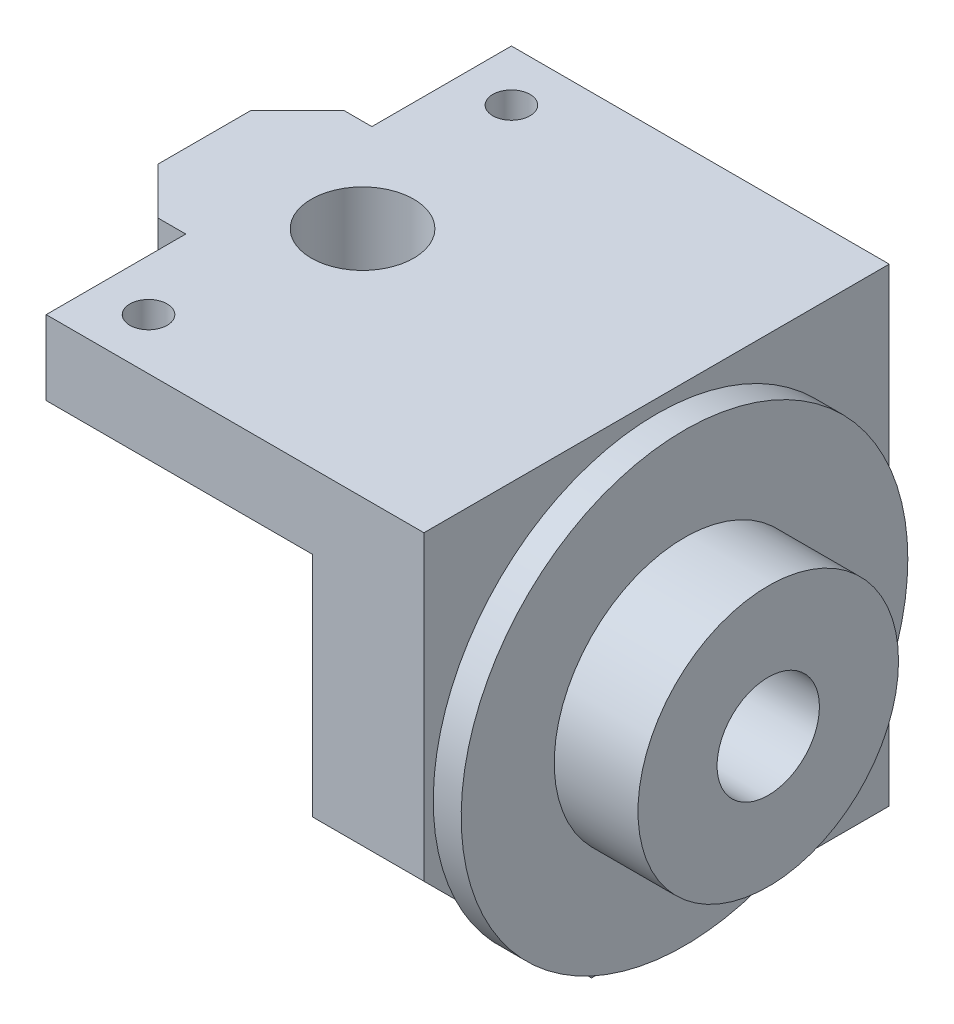
ISO-10303-21;
HEADER;
FILE_DESCRIPTION(('STEP AP214'),'2;1');
FILE_NAME('part.step','',(''),(''),'','','');
FILE_SCHEMA(('AUTOMOTIVE_DESIGN { 1 0 10303 214 1 1 1 1 }'));
ENDSEC;
DATA;
#1=APPLICATION_CONTEXT('core data for automotive mechanical design processes');
#2=APPLICATION_PROTOCOL_DEFINITION('international standard','automotive_design',2000,#1);
#3=PRODUCT_CONTEXT('',#1,'mechanical');
#4=PRODUCT('Part','Part','',(#3));
#5=PRODUCT_RELATED_PRODUCT_CATEGORY('part','',(#4));
#6=PRODUCT_DEFINITION_FORMATION('','',#4);
#7=PRODUCT_DEFINITION_CONTEXT('part definition',#1,'design');
#8=PRODUCT_DEFINITION('design','',#6,#7);
#9=PRODUCT_DEFINITION_SHAPE('','',#8);
#10=(LENGTH_UNIT() NAMED_UNIT(*) SI_UNIT(.MILLI.,.METRE.));
#11=(NAMED_UNIT(*) PLANE_ANGLE_UNIT() SI_UNIT($,.RADIAN.));
#12=(NAMED_UNIT(*) SI_UNIT($,.STERADIAN.) SOLID_ANGLE_UNIT());
#13=UNCERTAINTY_MEASURE_WITH_UNIT(LENGTH_MEASURE(1.E-05),#10,'distance_accuracy_value','');
#14=(GEOMETRIC_REPRESENTATION_CONTEXT(3) GLOBAL_UNCERTAINTY_ASSIGNED_CONTEXT((#13)) GLOBAL_UNIT_ASSIGNED_CONTEXT((#10,
#11,#12)) REPRESENTATION_CONTEXT('',''));
#15=CARTESIAN_POINT('',(0.,0.,0.));
#16=DIRECTION('',(0.,0.,1.));
#17=DIRECTION('',(1.,0.,0.));
#18=AXIS2_PLACEMENT_3D('',#15,#16,#17);
#19=CARTESIAN_POINT('',(-46.9860763337679,8.,-29.5221111165664));
#20=DIRECTION('',(1.,0.,0.));
#21=DIRECTION('',(0.,0.,-1.));
#22=AXIS2_PLACEMENT_3D('',#19,#20,#21);
#23=PLANE('',#22);
#24=DIRECTION('',(0.,-1.,0.));
#25=VECTOR('',#24,1.);
#26=CARTESIAN_POINT('',(-46.9860763337679,8.,-14.5221111165664));
#27=LINE('',#26,#25);
#28=CARTESIAN_POINT('',(-46.9860763337679,8.,-14.5221111165664));
#29=VERTEX_POINT('',#28);
#30=CARTESIAN_POINT('',(-46.9860763337679,0.,-14.5221111165664));
#31=VERTEX_POINT('',#30);
#32=EDGE_CURVE('E157',#29,#31,#27,.T.);
#33=ORIENTED_EDGE('',*,*,#32,.F.);
#34=DIRECTION('',(0.,0.,1.));
#35=VECTOR('',#34,1.);
#36=CARTESIAN_POINT('',(-46.9860763337679,8.,-29.5221111165664));
#37=LINE('',#36,#35);
#38=CARTESIAN_POINT('',(-46.9860763337679,8.,-29.5221111165664));
#39=VERTEX_POINT('',#38);
#40=EDGE_CURVE('E151',#39,#29,#37,.T.);
#41=ORIENTED_EDGE('',*,*,#40,.F.);
#42=DIRECTION('',(0.,-1.,0.));
#43=VECTOR('',#42,1.);
#44=CARTESIAN_POINT('',(-46.9860763337679,8.,-29.5221111165664));
#45=LINE('',#44,#43);
#46=CARTESIAN_POINT('',(-46.9860763337679,0.,-29.5221111165664));
#47=VERTEX_POINT('',#46);
#48=EDGE_CURVE('E241',#39,#47,#45,.T.);
#49=ORIENTED_EDGE('',*,*,#48,.T.);
#50=DIRECTION('',(0.,0.,1.));
#51=VECTOR('',#50,1.);
#52=CARTESIAN_POINT('',(-46.9860763337679,0.,-29.5221111165664));
#53=LINE('',#52,#51);
#54=EDGE_CURVE('E228',#47,#31,#53,.T.);
#55=ORIENTED_EDGE('',*,*,#54,.T.);
#56=EDGE_LOOP('',(#33,#41,#49,#55));
#57=FACE_BOUND('',#56,.T.);
#58=ADVANCED_FACE('F32',(#57),#23,.F.);
#59=DIRECTION('',(0.,1.,0.));
#60=VECTOR('',#59,1.);
#61=CARTESIAN_POINT('',(-46.9860763337679,8.,5.47788888343363));
#62=LINE('',#61,#60);
#63=CARTESIAN_POINT('',(-46.9860763337679,0.,5.47788888343363));
#64=VERTEX_POINT('',#63);
#65=CARTESIAN_POINT('',(-46.9860763337679,8.,5.47788888343363));
#66=VERTEX_POINT('',#65);
#67=EDGE_CURVE('E147',#64,#66,#62,.T.);
#68=ORIENTED_EDGE('',*,*,#67,.F.);
#69=CARTESIAN_POINT('',(-46.9860763337679,0.,20.4778888834336));
#70=VERTEX_POINT('',#69);
#71=EDGE_CURVE('E219',#64,#70,#53,.T.);
#72=ORIENTED_EDGE('',*,*,#71,.T.);
#73=DIRECTION('',(0.,-1.,0.));
#74=VECTOR('',#73,1.);
#75=CARTESIAN_POINT('',(-46.9860763337679,8.,20.4778888834336));
#76=LINE('',#75,#74);
#77=CARTESIAN_POINT('',(-46.9860763337679,8.,20.4778888834336));
#78=VERTEX_POINT('',#77);
#79=EDGE_CURVE('E150',#78,#70,#76,.T.);
#80=ORIENTED_EDGE('',*,*,#79,.F.);
#81=EDGE_CURVE('E133',#66,#78,#37,.T.);
#82=ORIENTED_EDGE('',*,*,#81,.F.);
#83=EDGE_LOOP('',(#68,#72,#80,#82));
#84=FACE_BOUND('',#83,.T.);
#85=ADVANCED_FACE('F146',(#84),#23,.F.);
#86=CARTESIAN_POINT('',(-3.38607633376794,-17.44,-4.52211111656637));
#87=DIRECTION('',(1.,0.,0.));
#88=DIRECTION('',(0.,0.,-1.));
#89=AXIS2_PLACEMENT_3D('',#86,#87,#88);
#90=PLANE('',#89);
#91=CARTESIAN_POINT('',(-3.38607633376794,-17.44,-4.52211111656637));
#92=DIRECTION('',(1.,0.,0.));
#93=DIRECTION('',(0.,0.,-1.));
#94=AXIS2_PLACEMENT_3D('',#91,#92,#93);
#95=CIRCLE('',#94,24.);
#96=CARTESIAN_POINT('',(-3.38607633376794,-17.44,-28.5221111165664));
#97=VERTEX_POINT('',#96);
#98=EDGE_CURVE('E183',#97,#97,#95,.T.);
#99=ORIENTED_EDGE('',*,*,#98,.T.);
#100=EDGE_LOOP('',(#99));
#101=FACE_BOUND('',#100,.T.);
#102=CARTESIAN_POINT('',(-3.38607633376794,-17.44,-4.52211111656637));
#103=DIRECTION('',(1.,0.,0.));
#104=DIRECTION('',(0.,0.,-1.));
#105=AXIS2_PLACEMENT_3D('',#102,#103,#104);
#106=CIRCLE('',#105,14.);
#107=CARTESIAN_POINT('',(-3.38607633376794,-17.44,-18.5221111165664));
#108=VERTEX_POINT('',#107);
#109=EDGE_CURVE('E179',#108,#108,#106,.T.);
#110=ORIENTED_EDGE('',*,*,#109,.F.);
#111=EDGE_LOOP('',(#110));
#112=FACE_BOUND('',#111,.T.);
#113=ADVANCED_FACE('F311',(#101,#112),#90,.T.);
#114=CARTESIAN_POINT('',(-6.38607633376794,8.,-29.5221111165664));
#115=DIRECTION('',(-1.,0.,0.));
#116=DIRECTION('',(0.,0.,1.));
#117=AXIS2_PLACEMENT_3D('',#114,#115,#116);
#118=PLANE('',#117);
#119=CARTESIAN_POINT('',(-6.38607633376794,-17.44,-4.52211111656637));
#120=DIRECTION('',(1.,0.,0.));
#121=DIRECTION('',(0.,0.,-1.));
#122=AXIS2_PLACEMENT_3D('',#119,#120,#121);
#123=CIRCLE('',#122,24.);
#124=CARTESIAN_POINT('',(-6.38607633376794,-39.0968542494924,5.82103463394115));
#125=VERTEX_POINT('',#124);
#126=CARTESIAN_POINT('',(-6.38607633376793,-27.7831457505075,17.1347431329261));
#127=VERTEX_POINT('',#126);
#128=EDGE_CURVE('E189',#125,#127,#123,.T.);
#129=ORIENTED_EDGE('',*,*,#128,.F.);
#130=DIRECTION('',(0.,0.707106781186548,0.707106781186548));
#131=VECTOR('',#130,1.);
#132=CARTESIAN_POINT('',(-6.38607633376794,-42.44,2.47788888343357));
#133=LINE('',#132,#131);
#134=CARTESIAN_POINT('',(-6.38607633376794,-42.44,2.47788888343358));
#135=VERTEX_POINT('',#134);
#136=EDGE_CURVE('E224',#125,#135,#133,.F.);
#137=ORIENTED_EDGE('',*,*,#136,.T.);
#138=DIRECTION('',(0.,0.,1.));
#139=VECTOR('',#138,1.);
#140=CARTESIAN_POINT('',(-6.38607633376793,-42.44,20.4778888834336));
#141=LINE('',#140,#139);
#142=CARTESIAN_POINT('',(-6.38607633376793,-42.44,-29.5221111165664));
#143=VERTEX_POINT('',#142);
#144=EDGE_CURVE('E190',#143,#135,#141,.T.);
#145=ORIENTED_EDGE('',*,*,#144,.F.);
#146=DIRECTION('',(0.,-1.,0.));
#147=VECTOR('',#146,1.);
#148=CARTESIAN_POINT('',(-6.38607633376794,8.,-29.5221111165664));
#149=LINE('',#148,#147);
#150=CARTESIAN_POINT('',(-6.38607633376794,8.,-29.5221111165664));
#151=VERTEX_POINT('',#150);
#152=EDGE_CURVE('E247',#151,#143,#149,.T.);
#153=ORIENTED_EDGE('',*,*,#152,.F.);
#154=DIRECTION('',(0.,0.,-1.));
#155=VECTOR('',#154,1.);
#156=CARTESIAN_POINT('',(-6.38607633376794,8.,-29.5221111165664));
#157=LINE('',#156,#155);
#158=CARTESIAN_POINT('',(-6.38607633376793,8.,20.4778888834336));
#159=VERTEX_POINT('',#158);
#160=EDGE_CURVE('E257',#159,#151,#157,.T.);
#161=ORIENTED_EDGE('',*,*,#160,.F.);
#162=DIRECTION('',(0.,-1.,0.));
#163=VECTOR('',#162,1.);
#164=CARTESIAN_POINT('',(-6.38607633376793,8.,20.4778888834336));
#165=LINE('',#164,#163);
#166=CARTESIAN_POINT('',(-6.38607633376793,-24.4399999999999,20.4778888834336));
#167=VERTEX_POINT('',#166);
#168=EDGE_CURVE('E245',#159,#167,#165,.T.);
#169=ORIENTED_EDGE('',*,*,#168,.T.);
#170=EDGE_CURVE('E225',#167,#127,#133,.F.);
#171=ORIENTED_EDGE('',*,*,#170,.T.);
#172=EDGE_LOOP('',(#129,#137,#145,#153,#161,#169,#171));
#173=FACE_BOUND('',#172,.T.);
#174=ADVANCED_FACE('F338',(#173),#118,.F.);
#175=CARTESIAN_POINT('',(0.,0.,0.));
#176=DIRECTION('',(0.,1.,0.));
#177=DIRECTION('',(0.,0.,1.));
#178=AXIS2_PLACEMENT_3D('',#175,#176,#177);
#179=PLANE('',#178);
#180=CARTESIAN_POINT('',(-41.4860763337679,0.,-24.0221111165664));
#181=DIRECTION('',(0.,1.,0.));
#182=DIRECTION('',(0.,0.,1.));
#183=AXIS2_PLACEMENT_3D('',#180,#181,#182);
#184=CIRCLE('',#183,2.);
#185=CARTESIAN_POINT('',(-41.4860763337679,0.,-22.0221111165664));
#186=VERTEX_POINT('',#185);
#187=EDGE_CURVE('E411',#186,#186,#184,.T.);
#188=ORIENTED_EDGE('',*,*,#187,.T.);
#189=EDGE_LOOP('',(#188));
#190=FACE_BOUND('',#189,.T.);
#191=CARTESIAN_POINT('',(-41.4860763337679,0.,14.9778888834336));
#192=DIRECTION('',(0.,1.,0.));
#193=DIRECTION('',(0.,0.,1.));
#194=AXIS2_PLACEMENT_3D('',#191,#192,#193);
#195=CIRCLE('',#194,2.);
#196=CARTESIAN_POINT('',(-41.4860763337679,0.,16.9778888834336));
#197=VERTEX_POINT('',#196);
#198=EDGE_CURVE('E415',#197,#197,#195,.T.);
#199=ORIENTED_EDGE('',*,*,#198,.T.);
#200=EDGE_LOOP('',(#199));
#201=FACE_BOUND('',#200,.T.);
#202=CARTESIAN_POINT('',(-37.986076333768,0.,-4.52211111656637));
#203=DIRECTION('',(0.,1.,0.));
#204=DIRECTION('',(0.,0.,1.));
#205=AXIS2_PLACEMENT_3D('',#202,#203,#204);
#206=CIRCLE('',#205,5.5);
#207=CARTESIAN_POINT('',(-37.986076333768,0.,0.977888883433626));
#208=VERTEX_POINT('',#207);
#209=EDGE_CURVE('E162',#208,#208,#206,.T.);
#210=ORIENTED_EDGE('',*,*,#209,.T.);
#211=EDGE_LOOP('',(#210));
#212=FACE_BOUND('',#211,.T.);
#213=DIRECTION('',(0.,0.,1.));
#214=VECTOR('',#213,1.);
#215=CARTESIAN_POINT('',(-54.9860763337679,0.,-14.5221111165664));
#216=LINE('',#215,#214);
#217=CARTESIAN_POINT('',(-54.9860763337679,0.,-9.52211111656635));
#218=VERTEX_POINT('',#217);
#219=CARTESIAN_POINT('',(-54.9860763337679,0.,0.477888883433611));
#220=VERTEX_POINT('',#219);
#221=EDGE_CURVE('E156',#218,#220,#216,.T.);
#222=ORIENTED_EDGE('',*,*,#221,.F.);
#223=DIRECTION('',(0.707106781186549,0.,-0.707106781186547));
#224=VECTOR('',#223,1.);
#225=CARTESIAN_POINT('',(-54.9860763337679,0.,-9.52211111656635));
#226=LINE('',#225,#224);
#227=CARTESIAN_POINT('',(-49.9860763337679,0.,-14.5221111165664));
#228=VERTEX_POINT('',#227);
#229=EDGE_CURVE('E54',#218,#228,#226,.T.);
#230=ORIENTED_EDGE('',*,*,#229,.T.);
#231=DIRECTION('',(1.,0.,0.));
#232=VECTOR('',#231,1.);
#233=CARTESIAN_POINT('',(-54.9860763337679,0.,-14.5221111165664));
#234=LINE('',#233,#232);
#235=EDGE_CURVE('E182',#228,#31,#234,.T.);
#236=ORIENTED_EDGE('',*,*,#235,.T.);
#237=ORIENTED_EDGE('',*,*,#54,.F.);
#238=DIRECTION('',(-1.,0.,0.));
#239=VECTOR('',#238,1.);
#240=CARTESIAN_POINT('',(-46.9860763337679,0.,-29.5221111165664));
#241=LINE('',#240,#239);
#242=CARTESIAN_POINT('',(-18.3860763337679,0.,-29.5221111165664));
#243=VERTEX_POINT('',#242);
#244=EDGE_CURVE('E152',#243,#47,#241,.T.);
#245=ORIENTED_EDGE('',*,*,#244,.F.);
#246=DIRECTION('',(0.,0.,-1.));
#247=VECTOR('',#246,1.);
#248=CARTESIAN_POINT('',(-18.3860763337679,0.,20.4778888834336));
#249=LINE('',#248,#247);
#250=CARTESIAN_POINT('',(-18.3860763337679,0.,20.4778888834336));
#251=VERTEX_POINT('',#250);
#252=EDGE_CURVE('E186',#251,#243,#249,.T.);
#253=ORIENTED_EDGE('',*,*,#252,.F.);
#254=DIRECTION('',(1.,0.,0.));
#255=VECTOR('',#254,1.);
#256=CARTESIAN_POINT('',(-46.9860763337679,0.,20.4778888834336));
#257=LINE('',#256,#255);
#258=EDGE_CURVE('E206',#70,#251,#257,.T.);
#259=ORIENTED_EDGE('',*,*,#258,.F.);
#260=ORIENTED_EDGE('',*,*,#71,.F.);
#261=DIRECTION('',(1.,0.,0.));
#262=VECTOR('',#261,1.);
#263=CARTESIAN_POINT('',(-54.9860763337679,0.,5.47788888343363));
#264=LINE('',#263,#262);
#265=CARTESIAN_POINT('',(-49.9860763337679,0.,5.47788888343363));
#266=VERTEX_POINT('',#265);
#267=EDGE_CURVE('E140',#266,#64,#264,.T.);
#268=ORIENTED_EDGE('',*,*,#267,.F.);
#269=DIRECTION('',(-0.707106781186549,0.,-0.707106781186547));
#270=VECTOR('',#269,1.);
#271=CARTESIAN_POINT('',(-54.9860763337679,0.,0.477888883433614));
#272=LINE('',#271,#270);
#273=EDGE_CURVE('E285',#266,#220,#272,.T.);
#274=ORIENTED_EDGE('',*,*,#273,.T.);
#275=EDGE_LOOP('',(#222,#230,#236,#237,#245,#253,#259,#260,#268,#274));
#276=FACE_BOUND('',#275,.T.);
#277=ADVANCED_FACE('F290',(#190,#201,#212,#276),#179,.F.);
#278=CARTESIAN_POINT('',(-46.9860763337679,8.,20.4778888834336));
#279=DIRECTION('',(0.,0.,-1.));
#280=DIRECTION('',(-1.,0.,0.));
#281=AXIS2_PLACEMENT_3D('',#278,#279,#280);
#282=PLANE('',#281);
#283=DIRECTION('',(0.,1.,0.));
#284=VECTOR('',#283,1.);
#285=CARTESIAN_POINT('',(-18.3860763337679,-42.44,20.4778888834336));
#286=LINE('',#285,#284);
#287=CARTESIAN_POINT('',(-18.3860763337679,-24.4399999999999,20.4778888834336));
#288=VERTEX_POINT('',#287);
#289=EDGE_CURVE('E211',#288,#251,#286,.T.);
#290=ORIENTED_EDGE('',*,*,#289,.F.);
#291=DIRECTION('',(1.,0.,0.));
#292=VECTOR('',#291,1.);
#293=CARTESIAN_POINT('',(-46.9860763337679,-24.4399999999999,20.4778888834336));
#294=LINE('',#293,#292);
#295=EDGE_CURVE('E222',#288,#167,#294,.T.);
#296=ORIENTED_EDGE('',*,*,#295,.T.);
#297=ORIENTED_EDGE('',*,*,#168,.F.);
#298=DIRECTION('',(1.,0.,0.));
#299=VECTOR('',#298,1.);
#300=CARTESIAN_POINT('',(-46.9860763337679,8.,20.4778888834336));
#301=LINE('',#300,#299);
#302=EDGE_CURVE('E259',#78,#159,#301,.T.);
#303=ORIENTED_EDGE('',*,*,#302,.F.);
#304=ORIENTED_EDGE('',*,*,#79,.T.);
#305=ORIENTED_EDGE('',*,*,#258,.T.);
#306=EDGE_LOOP('',(#290,#296,#297,#303,#304,#305));
#307=FACE_BOUND('',#306,.T.);
#308=ADVANCED_FACE('F314',(#307),#282,.F.);
#309=CARTESIAN_POINT('',(-46.9860763337679,8.,-29.5221111165664));
#310=DIRECTION('',(0.,0.,1.));
#311=DIRECTION('',(1.,0.,0.));
#312=AXIS2_PLACEMENT_3D('',#309,#310,#311);
#313=PLANE('',#312);
#314=ORIENTED_EDGE('',*,*,#152,.T.);
#315=DIRECTION('',(1.,0.,0.));
#316=VECTOR('',#315,1.);
#317=CARTESIAN_POINT('',(-6.38607633376793,-42.44,-29.5221111165664));
#318=LINE('',#317,#316);
#319=CARTESIAN_POINT('',(-18.3860763337679,-42.44,-29.5221111165664));
#320=VERTEX_POINT('',#319);
#321=EDGE_CURVE('E195',#320,#143,#318,.T.);
#322=ORIENTED_EDGE('',*,*,#321,.F.);
#323=DIRECTION('',(0.,1.,0.));
#324=VECTOR('',#323,1.);
#325=CARTESIAN_POINT('',(-18.3860763337679,-42.44,-29.5221111165664));
#326=LINE('',#325,#324);
#327=EDGE_CURVE('E198',#320,#243,#326,.T.);
#328=ORIENTED_EDGE('',*,*,#327,.T.);
#329=ORIENTED_EDGE('',*,*,#244,.T.);
#330=ORIENTED_EDGE('',*,*,#48,.F.);
#331=DIRECTION('',(-1.,0.,0.));
#332=VECTOR('',#331,1.);
#333=CARTESIAN_POINT('',(-46.9860763337679,8.,-29.5221111165664));
#334=LINE('',#333,#332);
#335=EDGE_CURVE('E234',#151,#39,#334,.T.);
#336=ORIENTED_EDGE('',*,*,#335,.F.);
#337=EDGE_LOOP('',(#314,#322,#328,#329,#330,#336));
#338=FACE_BOUND('',#337,.T.);
#339=ADVANCED_FACE('F346',(#338),#313,.F.);
#340=CARTESIAN_POINT('',(0.,8.,0.));
#341=DIRECTION('',(0.,1.,0.));
#342=DIRECTION('',(0.,0.,1.));
#343=AXIS2_PLACEMENT_3D('',#340,#341,#342);
#344=PLANE('',#343);
#345=CARTESIAN_POINT('',(-41.4860763337679,8.,-24.0221111165664));
#346=DIRECTION('',(0.,1.,0.));
#347=DIRECTION('',(0.,0.,1.));
#348=AXIS2_PLACEMENT_3D('',#345,#346,#347);
#349=CIRCLE('',#348,2.);
#350=CARTESIAN_POINT('',(-41.4860763337679,8.,-22.0221111165664));
#351=VERTEX_POINT('',#350);
#352=EDGE_CURVE('E408',#351,#351,#349,.T.);
#353=ORIENTED_EDGE('',*,*,#352,.F.);
#354=EDGE_LOOP('',(#353));
#355=FACE_BOUND('',#354,.T.);
#356=CARTESIAN_POINT('',(-41.4860763337679,8.,14.9778888834336));
#357=DIRECTION('',(0.,1.,0.));
#358=DIRECTION('',(0.,0.,1.));
#359=AXIS2_PLACEMENT_3D('',#356,#357,#358);
#360=CIRCLE('',#359,2.);
#361=CARTESIAN_POINT('',(-41.4860763337679,8.,16.9778888834336));
#362=VERTEX_POINT('',#361);
#363=EDGE_CURVE('E412',#362,#362,#360,.T.);
#364=ORIENTED_EDGE('',*,*,#363,.F.);
#365=EDGE_LOOP('',(#364));
#366=FACE_BOUND('',#365,.T.);
#367=CARTESIAN_POINT('',(-37.986076333768,8.,-4.52211111656637));
#368=DIRECTION('',(0.,1.,0.));
#369=DIRECTION('',(0.,0.,1.));
#370=AXIS2_PLACEMENT_3D('',#367,#368,#369);
#371=CIRCLE('',#370,5.5);
#372=CARTESIAN_POINT('',(-37.986076333768,8.,0.977888883433626));
#373=VERTEX_POINT('',#372);
#374=EDGE_CURVE('E427',#373,#373,#371,.T.);
#375=ORIENTED_EDGE('',*,*,#374,.F.);
#376=EDGE_LOOP('',(#375));
#377=FACE_BOUND('',#376,.T.);
#378=DIRECTION('',(1.,0.,0.));
#379=VECTOR('',#378,1.);
#380=CARTESIAN_POINT('',(-54.9860763337679,8.,-14.5221111165664));
#381=LINE('',#380,#379);
#382=CARTESIAN_POINT('',(-49.9860763337679,8.,-14.5221111165664));
#383=VERTEX_POINT('',#382);
#384=EDGE_CURVE('E141',#383,#29,#381,.T.);
#385=ORIENTED_EDGE('',*,*,#384,.F.);
#386=DIRECTION('',(-0.707106781186549,0.,0.707106781186547));
#387=VECTOR('',#386,1.);
#388=CARTESIAN_POINT('',(-32.2540937251671,8.,-32.2540937251672));
#389=LINE('',#388,#387);
#390=CARTESIAN_POINT('',(-54.986076333768,8.,-9.52211111656634));
#391=VERTEX_POINT('',#390);
#392=EDGE_CURVE('E11',#383,#391,#389,.T.);
#393=ORIENTED_EDGE('',*,*,#392,.T.);
#394=DIRECTION('',(0.,0.,-1.));
#395=VECTOR('',#394,1.);
#396=CARTESIAN_POINT('',(-54.9860763337679,8.,-14.5221111165664));
#397=LINE('',#396,#395);
#398=CARTESIAN_POINT('',(-54.986076333768,8.,0.477888883433589));
#399=VERTEX_POINT('',#398);
#400=EDGE_CURVE('E159',#399,#391,#397,.T.);
#401=ORIENTED_EDGE('',*,*,#400,.F.);
#402=DIRECTION('',(0.707106781186549,0.,0.707106781186547));
#403=VECTOR('',#402,1.);
#404=CARTESIAN_POINT('',(-27.7319826086007,8.,27.7319826086008));
#405=LINE('',#404,#403);
#406=CARTESIAN_POINT('',(-49.9860763337679,8.,5.47788888343363));
#407=VERTEX_POINT('',#406);
#408=EDGE_CURVE('E136',#399,#407,#405,.T.);
#409=ORIENTED_EDGE('',*,*,#408,.T.);
#410=DIRECTION('',(1.,0.,0.));
#411=VECTOR('',#410,1.);
#412=CARTESIAN_POINT('',(-54.9860763337679,8.,5.47788888343363));
#413=LINE('',#412,#411);
#414=EDGE_CURVE('E130',#407,#66,#413,.T.);
#415=ORIENTED_EDGE('',*,*,#414,.T.);
#416=ORIENTED_EDGE('',*,*,#81,.T.);
#417=ORIENTED_EDGE('',*,*,#302,.T.);
#418=ORIENTED_EDGE('',*,*,#160,.T.);
#419=ORIENTED_EDGE('',*,*,#335,.T.);
#420=ORIENTED_EDGE('',*,*,#40,.T.);
#421=EDGE_LOOP('',(#385,#393,#401,#409,#415,#416,#417,#418,#419,#420));
#422=FACE_BOUND('',#421,.T.);
#423=ADVANCED_FACE('F132',(#355,#366,#377,#422),#344,.T.);
#424=CARTESIAN_POINT('',(-18.3860763337679,-42.44,20.4778888834336));
#425=DIRECTION('',(1.,0.,0.));
#426=DIRECTION('',(0.,0.,-1.));
#427=AXIS2_PLACEMENT_3D('',#424,#425,#426);
#428=PLANE('',#427);
#429=CARTESIAN_POINT('',(-18.3860763337679,-17.44,-4.52211111656637));
#430=DIRECTION('',(1.,0.,0.));
#431=DIRECTION('',(0.,0.,-1.));
#432=AXIS2_PLACEMENT_3D('',#429,#430,#431);
#433=CIRCLE('',#432,5.5);
#434=CARTESIAN_POINT('',(-18.3860763337679,-17.44,-10.0221111165664));
#435=VERTEX_POINT('',#434);
#436=EDGE_CURVE('E424',#435,#435,#433,.T.);
#437=ORIENTED_EDGE('',*,*,#436,.T.);
#438=EDGE_LOOP('',(#437));
#439=FACE_BOUND('',#438,.T.);
#440=DIRECTION('',(0.,0.,-1.));
#441=VECTOR('',#440,1.);
#442=CARTESIAN_POINT('',(-18.3860763337679,-42.44,20.4778888834336));
#443=LINE('',#442,#441);
#444=CARTESIAN_POINT('',(-18.3860763337679,-42.44,2.47788888343358));
#445=VERTEX_POINT('',#444);
#446=EDGE_CURVE('E193',#445,#320,#443,.T.);
#447=ORIENTED_EDGE('',*,*,#446,.F.);
#448=DIRECTION('',(0.,-0.707106781186548,-0.707106781186548));
#449=VECTOR('',#448,1.);
#450=CARTESIAN_POINT('',(-18.3860763337679,-42.44,2.47788888343357));
#451=LINE('',#450,#449);
#452=EDGE_CURVE('E220',#445,#288,#451,.F.);
#453=ORIENTED_EDGE('',*,*,#452,.T.);
#454=ORIENTED_EDGE('',*,*,#289,.T.);
#455=ORIENTED_EDGE('',*,*,#252,.T.);
#456=ORIENTED_EDGE('',*,*,#327,.F.);
#457=EDGE_LOOP('',(#447,#453,#454,#455,#456));
#458=FACE_BOUND('',#457,.T.);
#459=ADVANCED_FACE('F328',(#439,#458),#428,.F.);
#460=CARTESIAN_POINT('',(0.,-42.44,0.));
#461=DIRECTION('',(0.,1.,0.));
#462=DIRECTION('',(0.,0.,1.));
#463=AXIS2_PLACEMENT_3D('',#460,#461,#462);
#464=PLANE('',#463);
#465=ORIENTED_EDGE('',*,*,#144,.T.);
#466=DIRECTION('',(-1.,0.,0.));
#467=VECTOR('',#466,1.);
#468=CARTESIAN_POINT('',(0.,-42.44,2.47788888343357));
#469=LINE('',#468,#467);
#470=EDGE_CURVE('E216',#135,#445,#469,.T.);
#471=ORIENTED_EDGE('',*,*,#470,.T.);
#472=ORIENTED_EDGE('',*,*,#446,.T.);
#473=ORIENTED_EDGE('',*,*,#321,.T.);
#474=EDGE_LOOP('',(#465,#471,#472,#473));
#475=FACE_BOUND('',#474,.T.);
#476=ADVANCED_FACE('F319',(#475),#464,.F.);
#477=CARTESIAN_POINT('',(0.,-42.44,2.47788888343357));
#478=DIRECTION('',(0.,0.707106781186547,-0.707106781186547));
#479=DIRECTION('',(-1.,0.,0.));
#480=AXIS2_PLACEMENT_3D('',#477,#478,#479);
#481=PLANE('',#480);
#482=ORIENTED_EDGE('',*,*,#170,.F.);
#483=ORIENTED_EDGE('',*,*,#295,.F.);
#484=ORIENTED_EDGE('',*,*,#452,.F.);
#485=ORIENTED_EDGE('',*,*,#470,.F.);
#486=ORIENTED_EDGE('',*,*,#136,.F.);
#487=EDGE_CURVE('E227',#127,#125,#133,.F.);
#488=ORIENTED_EDGE('',*,*,#487,.F.);
#489=EDGE_LOOP('',(#482,#483,#484,#485,#486,#488));
#490=FACE_BOUND('',#489,.T.);
#491=ADVANCED_FACE('F316',(#490),#481,.F.);
#492=CARTESIAN_POINT('',(-6.38607633376794,-17.44,-4.52211111656637));
#493=DIRECTION('',(1.,0.,0.));
#494=DIRECTION('',(0.,0.,-1.));
#495=AXIS2_PLACEMENT_3D('',#492,#493,#494);
#496=PLANE('',#495);
#497=EDGE_CURVE('E178',#127,#125,#123,.T.);
#498=ORIENTED_EDGE('',*,*,#497,.F.);
#499=ORIENTED_EDGE('',*,*,#487,.T.);
#500=EDGE_LOOP('',(#498,#499));
#501=FACE_BOUND('',#500,.T.);
#502=ADVANCED_FACE('F318',(#501),#496,.F.);
#503=CARTESIAN_POINT('',(-3.38607633376794,-17.44,-4.52211111656637));
#504=DIRECTION('',(-1.,0.,0.));
#505=DIRECTION('',(0.,0.,1.));
#506=AXIS2_PLACEMENT_3D('',#503,#504,#505);
#507=CYLINDRICAL_SURFACE('',#506,24.);
#508=ORIENTED_EDGE('',*,*,#98,.F.);
#509=EDGE_LOOP('',(#508));
#510=FACE_BOUND('',#509,.T.);
#511=ORIENTED_EDGE('',*,*,#497,.T.);
#512=ORIENTED_EDGE('',*,*,#128,.T.);
#513=EDGE_LOOP('',(#511,#512));
#514=FACE_BOUND('',#513,.T.);
#515=ADVANCED_FACE('F325',(#510,#514),#507,.T.);
#516=CARTESIAN_POINT('',(5.61392366623206,-17.44,-4.52211111656637));
#517=DIRECTION('',(-1.,0.,0.));
#518=DIRECTION('',(0.,0.,1.));
#519=AXIS2_PLACEMENT_3D('',#516,#517,#518);
#520=CYLINDRICAL_SURFACE('',#519,14.);
#521=CARTESIAN_POINT('',(5.61392366623206,-17.44,-4.52211111656637));
#522=DIRECTION('',(1.,0.,0.));
#523=DIRECTION('',(0.,0.,-1.));
#524=AXIS2_PLACEMENT_3D('',#521,#522,#523);
#525=CIRCLE('',#524,14.);
#526=CARTESIAN_POINT('',(5.61392366623206,-17.44,-18.5221111165664));
#527=VERTEX_POINT('',#526);
#528=EDGE_CURVE('E175',#527,#527,#525,.T.);
#529=ORIENTED_EDGE('',*,*,#528,.F.);
#530=EDGE_LOOP('',(#529));
#531=FACE_BOUND('',#530,.T.);
#532=ORIENTED_EDGE('',*,*,#109,.T.);
#533=EDGE_LOOP('',(#532));
#534=FACE_BOUND('',#533,.T.);
#535=ADVANCED_FACE('F353',(#531,#534),#520,.T.);
#536=CARTESIAN_POINT('',(5.61392366623206,-17.44,-4.52211111656637));
#537=DIRECTION('',(1.,0.,0.));
#538=DIRECTION('',(0.,0.,-1.));
#539=AXIS2_PLACEMENT_3D('',#536,#537,#538);
#540=PLANE('',#539);
#541=CARTESIAN_POINT('',(5.61392366623206,-17.44,-4.52211111656637));
#542=DIRECTION('',(1.,0.,0.));
#543=DIRECTION('',(0.,0.,-1.));
#544=AXIS2_PLACEMENT_3D('',#541,#542,#543);
#545=CIRCLE('',#544,5.5);
#546=CARTESIAN_POINT('',(5.61392366623206,-17.44,-10.0221111165664));
#547=VERTEX_POINT('',#546);
#548=EDGE_CURVE('E421',#547,#547,#545,.T.);
#549=ORIENTED_EDGE('',*,*,#548,.F.);
#550=EDGE_LOOP('',(#549));
#551=FACE_BOUND('',#550,.T.);
#552=ORIENTED_EDGE('',*,*,#528,.T.);
#553=EDGE_LOOP('',(#552));
#554=FACE_BOUND('',#553,.T.);
#555=ADVANCED_FACE('F359',(#551,#554),#540,.T.);
#556=CARTESIAN_POINT('',(-54.9860763337679,8.,-14.5221111165664));
#557=DIRECTION('',(0.,0.,1.));
#558=DIRECTION('',(0.,-1.,0.));
#559=AXIS2_PLACEMENT_3D('',#556,#557,#558);
#560=PLANE('',#559);
#561=ORIENTED_EDGE('',*,*,#235,.F.);
#562=DIRECTION('',(0.,1.,0.));
#563=VECTOR('',#562,1.);
#564=CARTESIAN_POINT('',(-49.9860763337679,8.,-14.5221111165664));
#565=LINE('',#564,#563);
#566=EDGE_CURVE('E40',#228,#383,#565,.T.);
#567=ORIENTED_EDGE('',*,*,#566,.T.);
#568=ORIENTED_EDGE('',*,*,#384,.T.);
#569=ORIENTED_EDGE('',*,*,#32,.T.);
#570=EDGE_LOOP('',(#561,#567,#568,#569));
#571=FACE_BOUND('',#570,.T.);
#572=ADVANCED_FACE('F264',(#571),#560,.F.);
#573=CARTESIAN_POINT('',(-54.9860763337679,8.,5.47788888343363));
#574=DIRECTION('',(0.,0.,-1.));
#575=DIRECTION('',(-1.,0.,0.));
#576=AXIS2_PLACEMENT_3D('',#573,#574,#575);
#577=PLANE('',#576);
#578=ORIENTED_EDGE('',*,*,#414,.F.);
#579=DIRECTION('',(0.,-1.,0.));
#580=VECTOR('',#579,1.);
#581=CARTESIAN_POINT('',(-49.9860763337679,0.,5.47788888343363));
#582=LINE('',#581,#580);
#583=EDGE_CURVE('E277',#407,#266,#582,.T.);
#584=ORIENTED_EDGE('',*,*,#583,.T.);
#585=ORIENTED_EDGE('',*,*,#267,.T.);
#586=ORIENTED_EDGE('',*,*,#67,.T.);
#587=EDGE_LOOP('',(#578,#584,#585,#586));
#588=FACE_BOUND('',#587,.T.);
#589=ADVANCED_FACE('F154',(#588),#577,.F.);
#590=CARTESIAN_POINT('',(-54.9860763337679,0.,0.));
#591=DIRECTION('',(-1.,0.,0.));
#592=DIRECTION('',(0.,0.,1.));
#593=AXIS2_PLACEMENT_3D('',#590,#591,#592);
#594=PLANE('',#593);
#595=ORIENTED_EDGE('',*,*,#400,.T.);
#596=DIRECTION('',(0.,-1.,0.));
#597=VECTOR('',#596,1.);
#598=CARTESIAN_POINT('',(-54.9860763337679,0.,-9.52211111656635));
#599=LINE('',#598,#597);
#600=EDGE_CURVE('E283',#391,#218,#599,.T.);
#601=ORIENTED_EDGE('',*,*,#600,.T.);
#602=ORIENTED_EDGE('',*,*,#221,.T.);
#603=DIRECTION('',(0.,1.,0.));
#604=VECTOR('',#603,1.);
#605=CARTESIAN_POINT('',(-54.9860763337679,8.,0.477888883433614));
#606=LINE('',#605,#604);
#607=EDGE_CURVE('E273',#220,#399,#606,.T.);
#608=ORIENTED_EDGE('',*,*,#607,.T.);
#609=EDGE_LOOP('',(#595,#601,#602,#608));
#610=FACE_BOUND('',#609,.T.);
#611=ADVANCED_FACE('F294',(#610),#594,.T.);
#612=CARTESIAN_POINT('',(-54.9860763337679,0.,0.477888883433614));
#613=DIRECTION('',(-0.707106781186546,0.,0.707106781186548));
#614=DIRECTION('',(0.,-1.,0.));
#615=AXIS2_PLACEMENT_3D('',#612,#613,#614);
#616=PLANE('',#615);
#617=ORIENTED_EDGE('',*,*,#273,.F.);
#618=ORIENTED_EDGE('',*,*,#583,.F.);
#619=ORIENTED_EDGE('',*,*,#408,.F.);
#620=ORIENTED_EDGE('',*,*,#607,.F.);
#621=EDGE_LOOP('',(#617,#618,#619,#620));
#622=FACE_BOUND('',#621,.T.);
#623=ADVANCED_FACE('F292',(#622),#616,.T.);
#624=CARTESIAN_POINT('',(-54.9860763337679,0.,-9.52211111656635));
#625=DIRECTION('',(-0.707106781186546,0.,-0.707106781186548));
#626=DIRECTION('',(0.,1.,0.));
#627=AXIS2_PLACEMENT_3D('',#624,#625,#626);
#628=PLANE('',#627);
#629=ORIENTED_EDGE('',*,*,#392,.F.);
#630=ORIENTED_EDGE('',*,*,#566,.F.);
#631=ORIENTED_EDGE('',*,*,#229,.F.);
#632=ORIENTED_EDGE('',*,*,#600,.F.);
#633=EDGE_LOOP('',(#629,#630,#631,#632));
#634=FACE_BOUND('',#633,.T.);
#635=ADVANCED_FACE('F34',(#634),#628,.T.);
#636=CARTESIAN_POINT('',(-37.986076333768,-42.440025,-4.52211111656637));
#637=DIRECTION('',(0.,1.,0.));
#638=DIRECTION('',(0.,0.,1.));
#639=AXIS2_PLACEMENT_3D('',#636,#637,#638);
#640=CYLINDRICAL_SURFACE('',#639,5.5);
#641=ORIENTED_EDGE('',*,*,#374,.T.);
#642=EDGE_LOOP('',(#641));
#643=FACE_BOUND('',#642,.T.);
#644=ORIENTED_EDGE('',*,*,#209,.F.);
#645=EDGE_LOOP('',(#644));
#646=FACE_BOUND('',#645,.T.);
#647=ADVANCED_FACE('F298',(#643,#646),#640,.F.);
#648=CARTESIAN_POINT('',(-54.986076333768,-17.44,-4.52211111656636));
#649=DIRECTION('',(1.,0.,0.));
#650=DIRECTION('',(0.,0.,-1.));
#651=AXIS2_PLACEMENT_3D('',#648,#649,#650);
#652=CYLINDRICAL_SURFACE('',#651,5.5);
#653=ORIENTED_EDGE('',*,*,#548,.T.);
#654=EDGE_LOOP('',(#653));
#655=FACE_BOUND('',#654,.T.);
#656=ORIENTED_EDGE('',*,*,#436,.F.);
#657=EDGE_LOOP('',(#656));
#658=FACE_BOUND('',#657,.T.);
#659=ADVANCED_FACE('F303',(#655,#658),#652,.F.);
#660=CARTESIAN_POINT('',(-41.4860763337679,-42.440025,14.9778888834336));
#661=DIRECTION('',(0.,1.,0.));
#662=DIRECTION('',(0.,0.,1.));
#663=AXIS2_PLACEMENT_3D('',#660,#661,#662);
#664=CYLINDRICAL_SURFACE('',#663,2.);
#665=ORIENTED_EDGE('',*,*,#363,.T.);
#666=EDGE_LOOP('',(#665));
#667=FACE_BOUND('',#666,.T.);
#668=ORIENTED_EDGE('',*,*,#198,.F.);
#669=EDGE_LOOP('',(#668));
#670=FACE_BOUND('',#669,.T.);
#671=ADVANCED_FACE('F395',(#667,#670),#664,.F.);
#672=CARTESIAN_POINT('',(-41.4860763337679,-42.440025,-24.0221111165664));
#673=DIRECTION('',(0.,1.,0.));
#674=DIRECTION('',(0.,0.,1.));
#675=AXIS2_PLACEMENT_3D('',#672,#673,#674);
#676=CYLINDRICAL_SURFACE('',#675,2.);
#677=ORIENTED_EDGE('',*,*,#352,.T.);
#678=EDGE_LOOP('',(#677));
#679=FACE_BOUND('',#678,.T.);
#680=ORIENTED_EDGE('',*,*,#187,.F.);
#681=EDGE_LOOP('',(#680));
#682=FACE_BOUND('',#681,.T.);
#683=ADVANCED_FACE('F399',(#679,#682),#676,.F.);
#684=CLOSED_SHELL('',(#58,#85,#113,#174,#277,#308,#339,#423,#459,#476,#491,#502,#515,#535,#555,
#572,#589,#611,#623,#635,#647,#659,#671,#683));
#685=MANIFOLD_SOLID_BREP('B2',#684);
#686=ADVANCED_BREP_SHAPE_REPRESENTATION('',(#18,#685),#14);
#687=SHAPE_DEFINITION_REPRESENTATION(#9,#686);
ENDSEC;
END-ISO-10303-21;
